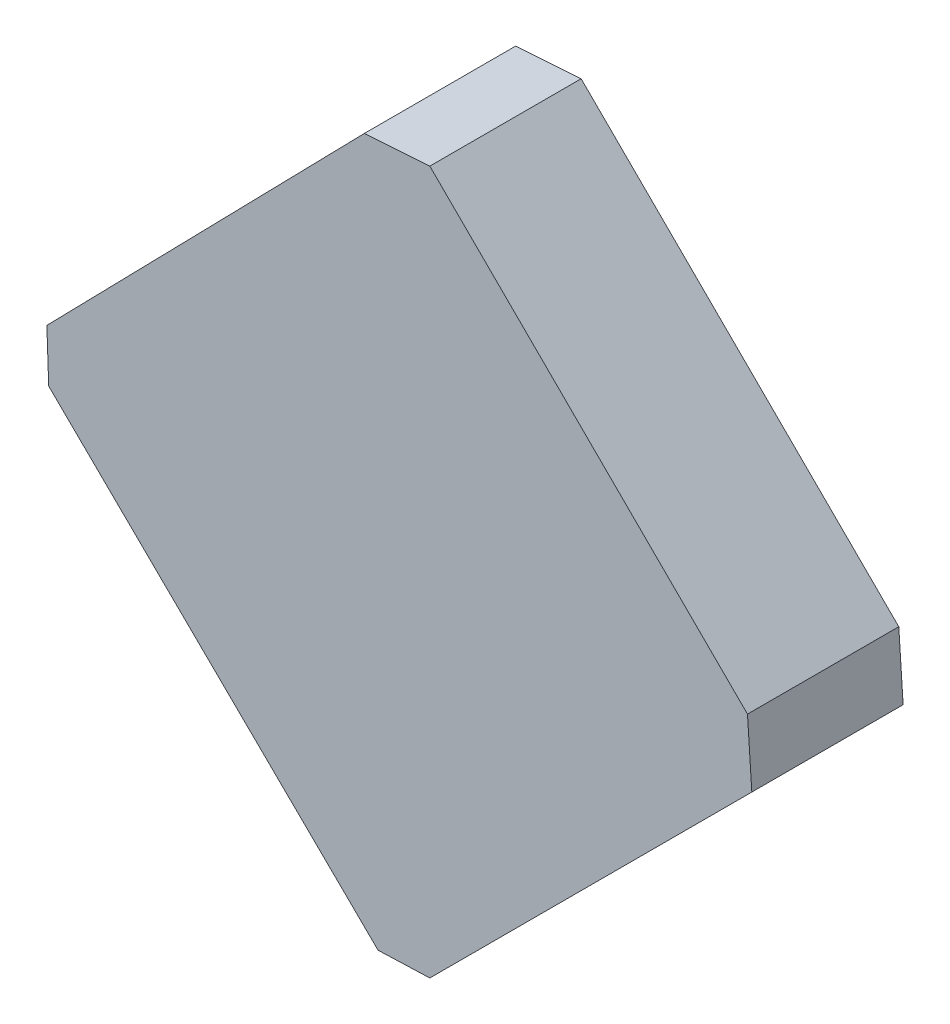
ISO-10303-21;
HEADER;
FILE_DESCRIPTION(('STEP AP214'),'2;1');
FILE_NAME('part.step','',(''),(''),'','','');
FILE_SCHEMA(('AUTOMOTIVE_DESIGN { 1 0 10303 214 1 1 1 1 }'));
ENDSEC;
DATA;
#1=APPLICATION_CONTEXT('core data for automotive mechanical design processes');
#2=APPLICATION_PROTOCOL_DEFINITION('international standard','automotive_design',2000,#1);
#3=PRODUCT_CONTEXT('',#1,'mechanical');
#4=PRODUCT('Part','Part','',(#3));
#5=PRODUCT_RELATED_PRODUCT_CATEGORY('part','',(#4));
#6=PRODUCT_DEFINITION_FORMATION('','',#4);
#7=PRODUCT_DEFINITION_CONTEXT('part definition',#1,'design');
#8=PRODUCT_DEFINITION('design','',#6,#7);
#9=PRODUCT_DEFINITION_SHAPE('','',#8);
#10=(LENGTH_UNIT() NAMED_UNIT(*) SI_UNIT(.MILLI.,.METRE.));
#11=(NAMED_UNIT(*) PLANE_ANGLE_UNIT() SI_UNIT($,.RADIAN.));
#12=(NAMED_UNIT(*) SI_UNIT($,.STERADIAN.) SOLID_ANGLE_UNIT());
#13=UNCERTAINTY_MEASURE_WITH_UNIT(LENGTH_MEASURE(1.E-05),#10,'distance_accuracy_value','');
#14=(GEOMETRIC_REPRESENTATION_CONTEXT(3) GLOBAL_UNCERTAINTY_ASSIGNED_CONTEXT((#13)) GLOBAL_UNIT_ASSIGNED_CONTEXT((#10,
#11,#12)) REPRESENTATION_CONTEXT('',''));
#15=CARTESIAN_POINT('',(0.,0.,0.));
#16=DIRECTION('',(0.,0.,1.));
#17=DIRECTION('',(1.,0.,0.));
#18=AXIS2_PLACEMENT_3D('',#15,#16,#17);
#19=CARTESIAN_POINT('',(-11.5861065300249,-0.946548716395971,5.));
#20=DIRECTION('',(0.999371905536894,0.0354371898372012,0.));
#21=DIRECTION('',(-0.0354371898372012,0.999371905536894,0.));
#22=AXIS2_PLACEMENT_3D('',#19,#20,#21);
#23=PLANE('',#22);
#24=DIRECTION('',(0.0354371898372012,-0.999371905536894,0.));
#25=VECTOR('',#24,1.);
#26=CARTESIAN_POINT('',(-11.5861065300249,-0.946548716395971,0.));
#27=LINE('',#26,#25);
#28=CARTESIAN_POINT('',(-11.6467261320542,0.762997877769283,0.));
#29=VERTEX_POINT('',#28);
#30=CARTESIAN_POINT('',(-11.5861065300249,-0.946548716395971,0.));
#31=VERTEX_POINT('',#30);
#32=EDGE_CURVE('E135',#29,#31,#27,.T.);
#33=ORIENTED_EDGE('',*,*,#32,.T.);
#34=DIRECTION('',(0.,0.,-1.));
#35=VECTOR('',#34,1.);
#36=CARTESIAN_POINT('',(-11.5861065300249,-0.946548716395971,5.));
#37=LINE('',#36,#35);
#38=CARTESIAN_POINT('',(-11.5861065300249,-0.946548716395971,5.));
#39=VERTEX_POINT('',#38);
#40=EDGE_CURVE('E11',#39,#31,#37,.T.);
#41=ORIENTED_EDGE('',*,*,#40,.F.);
#42=DIRECTION('',(0.0354371898372012,-0.999371905536894,0.));
#43=VECTOR('',#42,1.);
#44=CARTESIAN_POINT('',(-11.5861065300249,-0.946548716395971,5.));
#45=LINE('',#44,#43);
#46=CARTESIAN_POINT('',(-11.6467261320542,0.762997877769283,5.));
#47=VERTEX_POINT('',#46);
#48=EDGE_CURVE('E149',#47,#39,#45,.T.);
#49=ORIENTED_EDGE('',*,*,#48,.F.);
#50=DIRECTION('',(0.,0.,-1.));
#51=VECTOR('',#50,1.);
#52=CARTESIAN_POINT('',(-11.6467261320542,0.762997877769283,5.));
#53=LINE('',#52,#51);
#54=EDGE_CURVE('E131',#47,#29,#53,.T.);
#55=ORIENTED_EDGE('',*,*,#54,.T.);
#56=EDGE_LOOP('',(#33,#41,#49,#55));
#57=FACE_BOUND('',#56,.T.);
#58=ADVANCED_FACE('F39',(#57),#23,.F.);
#59=CARTESIAN_POINT('',(-0.702378275739918,-11.6467261320542,5.));
#60=DIRECTION('',(0.701068152541648,0.713094275318376,0.));
#61=DIRECTION('',(-0.713094275318377,0.701068152541648,0.));
#62=AXIS2_PLACEMENT_3D('',#59,#60,#61);
#63=PLANE('',#62);
#64=DIRECTION('',(0.713094275318376,-0.701068152541648,0.));
#65=VECTOR('',#64,1.);
#66=CARTESIAN_POINT('',(-0.702378275739918,-11.6467261320542,0.));
#67=LINE('',#66,#65);
#68=CARTESIAN_POINT('',(-0.702378275739918,-11.6467261320542,0.));
#69=VERTEX_POINT('',#68);
#70=EDGE_CURVE('E138',#31,#69,#67,.T.);
#71=ORIENTED_EDGE('',*,*,#70,.T.);
#72=DIRECTION('',(0.,0.,-1.));
#73=VECTOR('',#72,1.);
#74=CARTESIAN_POINT('',(-0.702378275739918,-11.6467261320542,5.));
#75=LINE('',#74,#73);
#76=CARTESIAN_POINT('',(-0.702378275739918,-11.6467261320542,5.));
#77=VERTEX_POINT('',#76);
#78=EDGE_CURVE('E47',#77,#69,#75,.T.);
#79=ORIENTED_EDGE('',*,*,#78,.F.);
#80=DIRECTION('',(0.713094275318376,-0.701068152541648,0.));
#81=VECTOR('',#80,1.);
#82=CARTESIAN_POINT('',(-0.702378275739918,-11.6467261320542,5.));
#83=LINE('',#82,#81);
#84=EDGE_CURVE('E98',#39,#77,#83,.T.);
#85=ORIENTED_EDGE('',*,*,#84,.F.);
#86=ORIENTED_EDGE('',*,*,#40,.T.);
#87=EDGE_LOOP('',(#71,#79,#85,#86));
#88=FACE_BOUND('',#87,.T.);
#89=ADVANCED_FACE('F184',(#88),#63,.F.);
#90=CARTESIAN_POINT('',(1.00716831842533,-11.5861065300249,5.));
#91=DIRECTION('',(-0.0354371898372002,0.999371905536894,0.));
#92=DIRECTION('',(-0.999371905536894,-0.0354371898372002,0.));
#93=AXIS2_PLACEMENT_3D('',#90,#91,#92);
#94=PLANE('',#93);
#95=DIRECTION('',(0.999371905536894,0.0354371898372002,0.));
#96=VECTOR('',#95,1.);
#97=CARTESIAN_POINT('',(1.00716831842533,-11.5861065300249,0.));
#98=LINE('',#97,#96);
#99=CARTESIAN_POINT('',(1.00716831842533,-11.5861065300249,0.));
#100=VERTEX_POINT('',#99);
#101=EDGE_CURVE('E140',#69,#100,#98,.T.);
#102=ORIENTED_EDGE('',*,*,#101,.T.);
#103=DIRECTION('',(0.,0.,-1.));
#104=VECTOR('',#103,1.);
#105=CARTESIAN_POINT('',(1.00716831842533,-11.5861065300249,5.));
#106=LINE('',#105,#104);
#107=CARTESIAN_POINT('',(1.00716831842533,-11.5861065300249,5.));
#108=VERTEX_POINT('',#107);
#109=EDGE_CURVE('E156',#108,#100,#106,.T.);
#110=ORIENTED_EDGE('',*,*,#109,.F.);
#111=DIRECTION('',(0.999371905536894,0.0354371898372002,0.));
#112=VECTOR('',#111,1.);
#113=CARTESIAN_POINT('',(1.00716831842533,-11.5861065300249,5.));
#114=LINE('',#113,#112);
#115=EDGE_CURVE('E164',#77,#108,#114,.T.);
#116=ORIENTED_EDGE('',*,*,#115,.F.);
#117=ORIENTED_EDGE('',*,*,#78,.T.);
#118=EDGE_LOOP('',(#102,#110,#116,#117));
#119=FACE_BOUND('',#118,.T.);
#120=ADVANCED_FACE('F162',(#119),#94,.F.);
#121=CARTESIAN_POINT('',(11.6467261320542,-0.94654871639602,5.));
#122=DIRECTION('',(-0.707106781186546,0.707106781186549,0.));
#123=DIRECTION('',(-0.707106781186549,-0.707106781186546,0.));
#124=AXIS2_PLACEMENT_3D('',#121,#122,#123);
#125=PLANE('',#124);
#126=DIRECTION('',(0.707106781186549,0.707106781186546,0.));
#127=VECTOR('',#126,1.);
#128=CARTESIAN_POINT('',(11.6467261320542,-0.94654871639602,0.));
#129=LINE('',#128,#127);
#130=CARTESIAN_POINT('',(11.6467261320542,-0.94654871639602,0.));
#131=VERTEX_POINT('',#130);
#132=EDGE_CURVE('E142',#100,#131,#129,.T.);
#133=ORIENTED_EDGE('',*,*,#132,.T.);
#134=DIRECTION('',(0.,0.,-1.));
#135=VECTOR('',#134,1.);
#136=CARTESIAN_POINT('',(11.6467261320542,-0.94654871639602,5.));
#137=LINE('',#136,#135);
#138=CARTESIAN_POINT('',(11.6467261320542,-0.94654871639602,5.));
#139=VERTEX_POINT('',#138);
#140=EDGE_CURVE('E153',#139,#131,#137,.T.);
#141=ORIENTED_EDGE('',*,*,#140,.F.);
#142=DIRECTION('',(0.707106781186549,0.707106781186546,0.));
#143=VECTOR('',#142,1.);
#144=CARTESIAN_POINT('',(11.6467261320542,-0.94654871639602,5.));
#145=LINE('',#144,#143);
#146=EDGE_CURVE('E176',#108,#139,#145,.T.);
#147=ORIENTED_EDGE('',*,*,#146,.F.);
#148=ORIENTED_EDGE('',*,*,#109,.T.);
#149=EDGE_LOOP('',(#133,#141,#147,#148));
#150=FACE_BOUND('',#149,.T.);
#151=ADVANCED_FACE('F172',(#150),#125,.F.);
#152=CARTESIAN_POINT('',(11.5036943994485,1.21413658581962,5.));
#153=DIRECTION('',(-0.997816127462771,-0.0660528256412887,0.));
#154=DIRECTION('',(0.0660528256412887,-0.997816127462771,0.));
#155=AXIS2_PLACEMENT_3D('',#152,#153,#154);
#156=PLANE('',#155);
#157=DIRECTION('',(-0.0660528256412887,0.997816127462771,0.));
#158=VECTOR('',#157,1.);
#159=CARTESIAN_POINT('',(11.5036943994485,1.21413658581962,0.));
#160=LINE('',#159,#158);
#161=CARTESIAN_POINT('',(11.5036943994485,1.21413658581962,0.));
#162=VERTEX_POINT('',#161);
#163=EDGE_CURVE('E144',#131,#162,#160,.T.);
#164=ORIENTED_EDGE('',*,*,#163,.T.);
#165=DIRECTION('',(0.,0.,-1.));
#166=VECTOR('',#165,1.);
#167=CARTESIAN_POINT('',(11.5036943994485,1.21413658581962,5.));
#168=LINE('',#167,#166);
#169=CARTESIAN_POINT('',(11.5036943994485,1.21413658581962,5.));
#170=VERTEX_POINT('',#169);
#171=EDGE_CURVE('E126',#170,#162,#168,.T.);
#172=ORIENTED_EDGE('',*,*,#171,.F.);
#173=DIRECTION('',(-0.0660528256412887,0.997816127462771,0.));
#174=VECTOR('',#173,1.);
#175=CARTESIAN_POINT('',(11.5036943994485,1.21413658581962,5.));
#176=LINE('',#175,#174);
#177=EDGE_CURVE('E117',#139,#170,#176,.T.);
#178=ORIENTED_EDGE('',*,*,#177,.F.);
#179=ORIENTED_EDGE('',*,*,#140,.T.);
#180=EDGE_LOOP('',(#164,#172,#178,#179));
#181=FACE_BOUND('',#180,.T.);
#182=ADVANCED_FACE('F175',(#181),#156,.F.);
#183=CARTESIAN_POINT('',(1.00716831842539,11.6467261320542,5.));
#184=DIRECTION('',(-0.704943345195177,-0.709263618173831,0.));
#185=DIRECTION('',(0.709263618173831,-0.704943345195177,0.));
#186=AXIS2_PLACEMENT_3D('',#183,#184,#185);
#187=PLANE('',#186);
#188=DIRECTION('',(-0.709263618173831,0.704943345195177,0.));
#189=VECTOR('',#188,1.);
#190=CARTESIAN_POINT('',(1.00716831842539,11.6467261320542,0.));
#191=LINE('',#190,#189);
#192=CARTESIAN_POINT('',(1.00716831842539,11.6467261320542,0.));
#193=VERTEX_POINT('',#192);
#194=EDGE_CURVE('E125',#162,#193,#191,.T.);
#195=ORIENTED_EDGE('',*,*,#194,.T.);
#196=DIRECTION('',(0.,0.,-1.));
#197=VECTOR('',#196,1.);
#198=CARTESIAN_POINT('',(1.00716831842539,11.6467261320542,5.));
#199=LINE('',#198,#197);
#200=CARTESIAN_POINT('',(1.00716831842539,11.6467261320542,5.));
#201=VERTEX_POINT('',#200);
#202=EDGE_CURVE('E122',#201,#193,#199,.T.);
#203=ORIENTED_EDGE('',*,*,#202,.F.);
#204=DIRECTION('',(-0.709263618173831,0.704943345195177,0.));
#205=VECTOR('',#204,1.);
#206=CARTESIAN_POINT('',(1.00716831842539,11.6467261320542,5.));
#207=LINE('',#206,#205);
#208=EDGE_CURVE('E111',#170,#201,#207,.T.);
#209=ORIENTED_EDGE('',*,*,#208,.F.);
#210=ORIENTED_EDGE('',*,*,#171,.T.);
#211=EDGE_LOOP('',(#195,#203,#209,#210));
#212=FACE_BOUND('',#211,.T.);
#213=ADVANCED_FACE('F123',(#212),#187,.F.);
#214=CARTESIAN_POINT('',(-1.15351698379026,11.5036943994485,5.));
#215=DIRECTION('',(0.0660528256412893,-0.997816127462771,0.));
#216=DIRECTION('',(0.997816127462771,0.0660528256412893,0.));
#217=AXIS2_PLACEMENT_3D('',#214,#215,#216);
#218=PLANE('',#217);
#219=DIRECTION('',(-0.997816127462771,-0.0660528256412893,0.));
#220=VECTOR('',#219,1.);
#221=CARTESIAN_POINT('',(-1.15351698379026,11.5036943994485,0.));
#222=LINE('',#221,#220);
#223=CARTESIAN_POINT('',(-1.15351698379026,11.5036943994485,0.));
#224=VERTEX_POINT('',#223);
#225=EDGE_CURVE('E84',#193,#224,#222,.T.);
#226=ORIENTED_EDGE('',*,*,#225,.T.);
#227=DIRECTION('',(0.,0.,-1.));
#228=VECTOR('',#227,1.);
#229=CARTESIAN_POINT('',(-1.15351698379026,11.5036943994485,5.));
#230=LINE('',#229,#228);
#231=CARTESIAN_POINT('',(-1.15351698379026,11.5036943994485,5.));
#232=VERTEX_POINT('',#231);
#233=EDGE_CURVE('E127',#232,#224,#230,.T.);
#234=ORIENTED_EDGE('',*,*,#233,.F.);
#235=DIRECTION('',(-0.997816127462771,-0.0660528256412893,0.));
#236=VECTOR('',#235,1.);
#237=CARTESIAN_POINT('',(-1.15351698379026,11.5036943994485,5.));
#238=LINE('',#237,#236);
#239=EDGE_CURVE('E115',#201,#232,#238,.T.);
#240=ORIENTED_EDGE('',*,*,#239,.F.);
#241=ORIENTED_EDGE('',*,*,#202,.T.);
#242=EDGE_LOOP('',(#226,#234,#240,#241));
#243=FACE_BOUND('',#242,.T.);
#244=ADVANCED_FACE('F129',(#243),#218,.F.);
#245=CARTESIAN_POINT('',(-11.6467261320542,0.762997877769283,5.));
#246=DIRECTION('',(0.715299733686096,-0.698817780961962,0.));
#247=DIRECTION('',(0.698817780961962,0.715299733686096,0.));
#248=AXIS2_PLACEMENT_3D('',#245,#246,#247);
#249=PLANE('',#248);
#250=DIRECTION('',(-0.698817780961962,-0.715299733686096,0.));
#251=VECTOR('',#250,1.);
#252=CARTESIAN_POINT('',(-11.6467261320542,0.762997877769283,0.));
#253=LINE('',#252,#251);
#254=EDGE_CURVE('E90',#224,#29,#253,.T.);
#255=ORIENTED_EDGE('',*,*,#254,.T.);
#256=ORIENTED_EDGE('',*,*,#54,.F.);
#257=DIRECTION('',(-0.698817780961962,-0.715299733686096,0.));
#258=VECTOR('',#257,1.);
#259=CARTESIAN_POINT('',(-11.6467261320542,0.762997877769283,5.));
#260=LINE('',#259,#258);
#261=EDGE_CURVE('E55',#232,#47,#260,.T.);
#262=ORIENTED_EDGE('',*,*,#261,.F.);
#263=ORIENTED_EDGE('',*,*,#233,.T.);
#264=EDGE_LOOP('',(#255,#256,#262,#263));
#265=FACE_BOUND('',#264,.T.);
#266=ADVANCED_FACE('F200',(#265),#249,.F.);
#267=CARTESIAN_POINT('',(0.,0.,5.));
#268=DIRECTION('',(0.,0.,1.));
#269=DIRECTION('',(1.,0.,0.));
#270=AXIS2_PLACEMENT_3D('',#267,#268,#269);
#271=PLANE('',#270);
#272=ORIENTED_EDGE('',*,*,#48,.T.);
#273=ORIENTED_EDGE('',*,*,#84,.T.);
#274=ORIENTED_EDGE('',*,*,#115,.T.);
#275=ORIENTED_EDGE('',*,*,#146,.T.);
#276=ORIENTED_EDGE('',*,*,#177,.T.);
#277=ORIENTED_EDGE('',*,*,#208,.T.);
#278=ORIENTED_EDGE('',*,*,#239,.T.);
#279=ORIENTED_EDGE('',*,*,#261,.T.);
#280=EDGE_LOOP('',(#272,#273,#274,#275,#276,#277,#278,#279));
#281=FACE_BOUND('',#280,.T.);
#282=ADVANCED_FACE('F113',(#281),#271,.T.);
#283=CARTESIAN_POINT('',(0.,0.,0.));
#284=DIRECTION('',(0.,0.,1.));
#285=DIRECTION('',(1.,0.,0.));
#286=AXIS2_PLACEMENT_3D('',#283,#284,#285);
#287=PLANE('',#286);
#288=ORIENTED_EDGE('',*,*,#32,.F.);
#289=ORIENTED_EDGE('',*,*,#254,.F.);
#290=ORIENTED_EDGE('',*,*,#225,.F.);
#291=ORIENTED_EDGE('',*,*,#194,.F.);
#292=ORIENTED_EDGE('',*,*,#163,.F.);
#293=ORIENTED_EDGE('',*,*,#132,.F.);
#294=ORIENTED_EDGE('',*,*,#101,.F.);
#295=ORIENTED_EDGE('',*,*,#70,.F.);
#296=EDGE_LOOP('',(#288,#289,#290,#291,#292,#293,#294,#295));
#297=FACE_BOUND('',#296,.T.);
#298=ADVANCED_FACE('F168',(#297),#287,.F.);
#299=CLOSED_SHELL('',(#58,#89,#120,#151,#182,#213,#244,#266,#282,#298));
#300=MANIFOLD_SOLID_BREP('B2',#299);
#301=ADVANCED_BREP_SHAPE_REPRESENTATION('',(#18,#300),#14);
#302=SHAPE_DEFINITION_REPRESENTATION(#9,#301);
ENDSEC;
END-ISO-10303-21;
